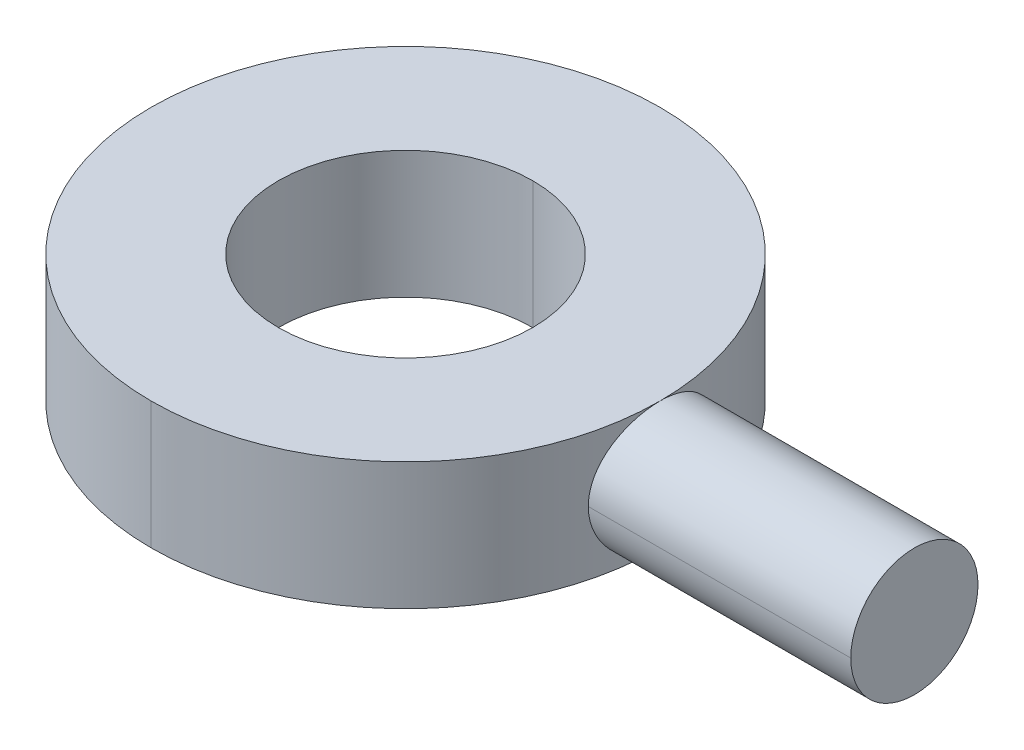
ISO-10303-21;
HEADER;
FILE_DESCRIPTION(('STEP AP214'),'2;1');
FILE_NAME('part.step','',(''),(''),'','','');
FILE_SCHEMA(('AUTOMOTIVE_DESIGN { 1 0 10303 214 1 1 1 1 }'));
ENDSEC;
DATA;
#1=APPLICATION_CONTEXT('core data for automotive mechanical design processes');
#2=APPLICATION_PROTOCOL_DEFINITION('international standard','automotive_design',2000,#1);
#3=PRODUCT_CONTEXT('',#1,'mechanical');
#4=PRODUCT('Part','Part','',(#3));
#5=PRODUCT_RELATED_PRODUCT_CATEGORY('part','',(#4));
#6=PRODUCT_DEFINITION_FORMATION('','',#4);
#7=PRODUCT_DEFINITION_CONTEXT('part definition',#1,'design');
#8=PRODUCT_DEFINITION('design','',#6,#7);
#9=PRODUCT_DEFINITION_SHAPE('','',#8);
#10=(LENGTH_UNIT() NAMED_UNIT(*) SI_UNIT(.MILLI.,.METRE.));
#11=(NAMED_UNIT(*) PLANE_ANGLE_UNIT() SI_UNIT($,.RADIAN.));
#12=(NAMED_UNIT(*) SI_UNIT($,.STERADIAN.) SOLID_ANGLE_UNIT());
#13=UNCERTAINTY_MEASURE_WITH_UNIT(LENGTH_MEASURE(1.E-05),#10,'distance_accuracy_value','');
#14=(GEOMETRIC_REPRESENTATION_CONTEXT(3) GLOBAL_UNCERTAINTY_ASSIGNED_CONTEXT((#13)) GLOBAL_UNIT_ASSIGNED_CONTEXT((#10,
#11,#12)) REPRESENTATION_CONTEXT('',''));
#15=CARTESIAN_POINT('',(0.,0.,0.));
#16=DIRECTION('',(0.,0.,1.));
#17=DIRECTION('',(1.,0.,0.));
#18=AXIS2_PLACEMENT_3D('',#15,#16,#17);
#19=CARTESIAN_POINT('',(100.,12.5,0.));
#20=DIRECTION('',(-1.,0.,0.));
#21=DIRECTION('',(0.,0.,1.));
#22=AXIS2_PLACEMENT_3D('',#19,#20,#21);
#23=CYLINDRICAL_SURFACE('',#22,12.5);
#24=CARTESIAN_POINT('',(100.,12.5,0.));
#25=DIRECTION('',(1.,0.,0.));
#26=DIRECTION('',(0.,0.,-1.));
#27=AXIS2_PLACEMENT_3D('',#24,#25,#26);
#28=CIRCLE('',#27,12.5);
#29=CARTESIAN_POINT('',(100.,12.5,-12.5));
#30=VERTEX_POINT('',#29);
#31=CARTESIAN_POINT('',(100.,12.5,12.5));
#32=VERTEX_POINT('',#31);
#33=EDGE_CURVE('E148',#30,#32,#28,.T.);
#34=ORIENTED_EDGE('',*,*,#33,.F.);
#35=DIRECTION('',(-1.,0.,0.));
#36=VECTOR('',#35,1.);
#37=CARTESIAN_POINT('',(100.,12.5,-12.5));
#38=LINE('',#37,#36);
#39=CARTESIAN_POINT('',(48.4122918275927,12.5,-12.5));
#40=VERTEX_POINT('',#39);
#41=EDGE_CURVE('E152',#30,#40,#38,.T.);
#42=ORIENTED_EDGE('',*,*,#41,.T.);
#43=CARTESIAN_POINT('',(48.4122918275927,12.5,-12.5));
#44=CARTESIAN_POINT('',(48.4122519531523,12.8456935189309,-12.5000438414443));
#45=CARTESIAN_POINT('',(48.4159931750957,13.1913731142733,-12.4856614744908));
#46=CARTESIAN_POINT('',(48.4307475860603,13.88014719941,-12.4283667765381));
#47=CARTESIAN_POINT('',(48.4417595505938,14.2232421146592,-12.3854592495393));
#48=CARTESIAN_POINT('',(48.4707358201207,14.9037129701783,-12.2715527731372));
#49=CARTESIAN_POINT('',(48.4886858982787,15.2410991482428,-12.2006113016633));
#50=CARTESIAN_POINT('',(48.5309895530518,15.9084882046774,-12.0312391309484));
#51=CARTESIAN_POINT('',(48.5553432173392,16.2384909818931,-11.9328080553419));
#52=CARTESIAN_POINT('',(48.6097365025065,16.8887912794784,-11.7092579086062));
#53=CARTESIAN_POINT('',(48.6397753687366,17.209090081408,-11.584142379273));
#54=CARTESIAN_POINT('',(48.7046751518737,17.8379018633208,-11.308169711536));
#55=CARTESIAN_POINT('',(48.7395362799559,18.1464143264041,-11.1573114457449));
#56=CARTESIAN_POINT('',(48.8131048460808,18.7497107015154,-10.8309174353739));
#57=CARTESIAN_POINT('',(48.8518132316505,19.044491205164,-10.6553756071326));
#58=CARTESIAN_POINT('',(48.931998698195,19.6183736309559,-10.2808638945076));
#59=CARTESIAN_POINT('',(48.9734758108004,19.8974753739149,-10.0818937424544));
#60=CARTESIAN_POINT('',(49.058905671041,20.4435756693406,-9.65771613587637));
#61=CARTESIAN_POINT('',(49.1028910689727,20.7102280989142,-9.43206952415031));
#62=CARTESIAN_POINT('',(49.1913473701372,21.2236819727533,-8.95930589164594));
#63=CARTESIAN_POINT('',(49.2358182788048,21.4704831945467,-8.71218863031098));
#64=CARTESIAN_POINT('',(49.3240302284843,21.9426571619296,-8.19805271085466));
#65=CARTESIAN_POINT('',(49.3677711258657,22.1680257306646,-7.93103019155515));
#66=CARTESIAN_POINT('',(49.4533151843612,22.5957567902098,-7.37886531650099));
#67=CARTESIAN_POINT('',(49.4951183643153,22.7981195047291,-7.09372313698402));
#68=CARTESIAN_POINT('',(49.5762175563378,23.1811466542233,-6.50298294406659));
#69=CARTESIAN_POINT('',(49.615469208601,23.3614597272174,-6.19715085731563));
#70=CARTESIAN_POINT('',(49.6896871340011,23.6956043616818,-5.57085338209336));
#71=CARTESIAN_POINT('',(49.7246535283887,23.8494366724711,-5.25038840800964));
#72=CARTESIAN_POINT('',(49.7892831915527,24.1293274696282,-4.59727113805758));
#73=CARTESIAN_POINT('',(49.8189496850155,24.2554028554226,-4.26462640237347));
#74=CARTESIAN_POINT('',(49.8721443661297,24.4788389293963,-3.5894023044437));
#75=CARTESIAN_POINT('',(49.8956740655167,24.5762066901745,-3.24682541203115));
#76=CARTESIAN_POINT('',(49.9295759615369,24.7153806955743,-2.66344734260586));
#77=CARTESIAN_POINT('',(49.9417578900303,24.7650269913513,-2.42458906516948));
#78=CARTESIAN_POINT('',(49.9627632828073,24.8502802538115,-1.94423792027906));
#79=CARTESIAN_POINT('',(49.9715870238673,24.8858883775073,-1.70274527163402));
#80=CARTESIAN_POINT('',(49.9857447668905,24.9428888464443,-1.21818294171803));
#81=CARTESIAN_POINT('',(49.9910815162478,24.9642923836615,-0.975114654768771));
#82=CARTESIAN_POINT('',(49.9982139141306,24.9928549009413,-0.488032450329455));
#83=CARTESIAN_POINT('',(50.0000087099502,25.0000104508834,-0.244018319296118));
#84=CARTESIAN_POINT('',(50.,25.,0.));
#85=B_SPLINE_CURVE_WITH_KNOTS('',3,(#43,#44,#45,#46,#47,#48,#49,#50,#51,#52,#53,#54,#55,#56,#57,
#58,#59,#60,#61,#62,#63,#64,#65,#66,#67,#68,#69,#70,#71,#72,#73,#74,#75,#76,#77,#78,#79,#80,#81,
#82,#83,#84),.UNSPECIFIED.,.F.,.F.,(4,2,2,2,2,2,2,2,2,2,2,2,2,2,2,2,2,2,2,2,4),(0.,
1.03674003842468,2.07330552083437,3.10775667135985,4.14222198545364,5.17655008154221,
6.21092348702068,7.24555227879674,8.28019289239135,9.33518785344895,10.39019463617,
11.4454066019952,12.5006083060576,13.5708877009475,14.6411368054543,15.7107324902355,
16.7800644417881,17.5124625500417,18.244800282127,18.9765603086904,19.7084964809608),.UNSPECIFIED.);
#86=CARTESIAN_POINT('',(50.,25.,0.));
#87=VERTEX_POINT('',#86);
#88=EDGE_CURVE('E156',#40,#87,#85,.T.);
#89=ORIENTED_EDGE('',*,*,#88,.T.);
#90=CARTESIAN_POINT('',(50.,25.,0.));
#91=CARTESIAN_POINT('',(50.0000353851579,25.0000434644936,0.345864397080895));
#92=CARTESIAN_POINT('',(49.9964125846679,24.985647266418,0.691715869367748));
#93=CARTESIAN_POINT('',(49.9821075989999,24.9282945716392,1.38084346252051));
#94=CARTESIAN_POINT('',(49.9714265125323,24.8853425200049,1.72411997580132));
#95=CARTESIAN_POINT('',(49.9432894382411,24.7713090014944,2.4049883888634));
#96=CARTESIAN_POINT('',(49.9258467914197,24.7002829211291,2.74259012522333));
#97=CARTESIAN_POINT('',(49.8846764301155,24.5307002564981,3.41041355146004));
#98=CARTESIAN_POINT('',(49.8609486493148,24.4321433817395,3.74063516342525));
#99=CARTESIAN_POINT('',(49.8078538467151,24.2082921260051,4.39138850867105));
#100=CARTESIAN_POINT('',(49.7784872288902,24.0829996603324,4.71192093419547));
#101=CARTESIAN_POINT('',(49.7149052698882,23.8066301075679,5.3411805319624));
#102=CARTESIAN_POINT('',(49.6806897229061,23.6555519259873,5.64990720242213));
#103=CARTESIAN_POINT('',(49.6083167638375,23.3286880909102,6.25358769973763));
#104=CARTESIAN_POINT('',(49.5701585196911,23.152897219256,6.5485386002301));
#105=CARTESIAN_POINT('',(49.4909175233785,22.7778645158071,7.12271639666512));
#106=CARTESIAN_POINT('',(49.4498347403539,22.57862243655,7.40194312663673));
#107=CARTESIAN_POINT('',(49.3650581243013,22.1541691968603,7.94787686221989));
#108=CARTESIAN_POINT('',(49.3213302399778,21.9285490658122,8.21426068551634));
#109=CARTESIAN_POINT('',(49.2331611896887,21.4558949277343,8.72717429054878));
#110=CARTESIAN_POINT('',(49.1887200150751,21.2088606609225,8.97370383135579));
#111=CARTESIAN_POINT('',(49.1003361335477,20.6949424195365,9.44534721429645));
#112=CARTESIAN_POINT('',(49.0563935402802,20.4280540201688,9.67045625691743));
#113=CARTESIAN_POINT('',(48.9702382961189,19.8762116985148,10.0976860637948));
#114=CARTESIAN_POINT('',(48.9280256304544,19.5912579305275,10.2998070243547));
#115=CARTESIAN_POINT('',(48.8459005479228,19.0006756753362,10.6825514917154));
#116=CARTESIAN_POINT('',(48.8060328421376,18.6947987866027,10.8628015817255));
#117=CARTESIAN_POINT('',(48.7304900022203,18.068418823622,11.19681562835));
#118=CARTESIAN_POINT('',(48.6948147478651,17.7479161691503,11.3505803445199));
#119=CARTESIAN_POINT('',(48.6287574014613,17.0947306268087,11.630331388659));
#120=CARTESIAN_POINT('',(48.5983719191793,16.7620557068919,11.7563355223369));
#121=CARTESIAN_POINT('',(48.5438120978055,16.0867604855525,11.9796305293237));
#122=CARTESIAN_POINT('',(48.5196362151463,15.744142679323,12.076928539228));
#123=CARTESIAN_POINT('',(48.4847879268861,15.160952352703,12.2159193460693));
#124=CARTESIAN_POINT('',(48.4722622855959,14.9223302183091,12.2654684084595));
#125=CARTESIAN_POINT('',(48.4506520039379,14.4424509190243,12.3505565676766));
#126=CARTESIAN_POINT('',(48.4415670770253,14.2011939752844,12.3860968311755));
#127=CARTESIAN_POINT('',(48.4269849261362,13.7170875925611,12.4429916084321));
#128=CARTESIAN_POINT('',(48.4214850830883,13.4742394473259,12.4643564781824));
#129=CARTESIAN_POINT('',(48.4141331685501,12.987595800071,12.492867681304));
#130=CARTESIAN_POINT('',(48.4122819878133,12.7438000812706,12.5000105426389));
#131=CARTESIAN_POINT('',(48.4122918275927,12.5,12.5));
#132=B_SPLINE_CURVE_WITH_KNOTS('',3,(#90,#91,#92,#93,#94,#95,#96,#97,#98,#99,#100,#101,#102,
#103,#104,#105,#106,#107,#108,#109,#110,#111,#112,#113,#114,#115,#116,#117,#118,#119,#120,#121,
#122,#123,#124,#125,#126,#127,#128,#129,#130,#131),.UNSPECIFIED.,.F.,.F.,(4,2,2,2,2,2,2,2,2,2,2,
2,2,2,2,2,2,2,2,2,4),(0.,1.03725511374434,2.0743488037948,3.10940657049817,4.14447525909134,
5.17946982158484,6.21450832590989,7.24976571086483,8.28503402106688,9.33927327996868,
10.393525329992,11.4480130440059,12.5024917526973,13.5729969152005,14.6434713723183,
15.7132572124358,16.7827768698235,17.5144754824531,18.246113145332,18.9772157118582,
19.7084967414768),.UNSPECIFIED.);
#133=CARTESIAN_POINT('',(48.4122918275927,12.5,12.5));
#134=VERTEX_POINT('',#133);
#135=EDGE_CURVE('E10',#87,#134,#132,.T.);
#136=ORIENTED_EDGE('',*,*,#135,.T.);
#137=DIRECTION('',(-1.,0.,0.));
#138=VECTOR('',#137,1.);
#139=CARTESIAN_POINT('',(100.,12.5,12.5));
#140=LINE('',#139,#138);
#141=EDGE_CURVE('E175',#32,#134,#140,.T.);
#142=ORIENTED_EDGE('',*,*,#141,.F.);
#143=EDGE_LOOP('',(#34,#42,#89,#136,#142));
#144=FACE_BOUND('',#143,.T.);
#145=ADVANCED_FACE('F16',(#144),#23,.T.);
#146=CARTESIAN_POINT('',(0.,25.,0.));
#147=DIRECTION('',(0.,-1.,0.));
#148=DIRECTION('',(0.,0.,-1.));
#149=AXIS2_PLACEMENT_3D('',#146,#147,#148);
#150=CYLINDRICAL_SURFACE('',#149,25.);
#151=CARTESIAN_POINT('',(0.,25.,0.));
#152=DIRECTION('',(0.,1.,0.));
#153=DIRECTION('',(0.,0.,1.));
#154=AXIS2_PLACEMENT_3D('',#151,#152,#153);
#155=CIRCLE('',#154,25.);
#156=CARTESIAN_POINT('',(0.,25.,-25.));
#157=VERTEX_POINT('',#156);
#158=CARTESIAN_POINT('',(0.,25.,25.));
#159=VERTEX_POINT('',#158);
#160=EDGE_CURVE('E108',#157,#159,#155,.T.);
#161=ORIENTED_EDGE('',*,*,#160,.T.);
#162=DIRECTION('',(0.,-1.,0.));
#163=VECTOR('',#162,1.);
#164=CARTESIAN_POINT('',(0.,25.,25.));
#165=LINE('',#164,#163);
#166=CARTESIAN_POINT('',(0.,0.,25.));
#167=VERTEX_POINT('',#166);
#168=EDGE_CURVE('E137',#159,#167,#165,.T.);
#169=ORIENTED_EDGE('',*,*,#168,.T.);
#170=CARTESIAN_POINT('',(0.,0.,0.));
#171=DIRECTION('',(0.,1.,0.));
#172=DIRECTION('',(0.,0.,1.));
#173=AXIS2_PLACEMENT_3D('',#170,#171,#172);
#174=CIRCLE('',#173,25.);
#175=CARTESIAN_POINT('',(0.,0.,-25.));
#176=VERTEX_POINT('',#175);
#177=EDGE_CURVE('E115',#176,#167,#174,.T.);
#178=ORIENTED_EDGE('',*,*,#177,.F.);
#179=DIRECTION('',(0.,-1.,0.));
#180=VECTOR('',#179,1.);
#181=CARTESIAN_POINT('',(0.,25.,-25.));
#182=LINE('',#181,#180);
#183=EDGE_CURVE('E131',#157,#176,#182,.T.);
#184=ORIENTED_EDGE('',*,*,#183,.F.);
#185=EDGE_LOOP('',(#161,#169,#178,#184));
#186=FACE_BOUND('',#185,.T.);
#187=ADVANCED_FACE('F132',(#186),#150,.F.);
#188=CARTESIAN_POINT('',(0.,25.,0.));
#189=DIRECTION('',(0.,-1.,0.));
#190=DIRECTION('',(0.,0.,-1.));
#191=AXIS2_PLACEMENT_3D('',#188,#189,#190);
#192=CYLINDRICAL_SURFACE('',#191,50.);
#193=CARTESIAN_POINT('',(0.,25.,0.));
#194=DIRECTION('',(0.,1.,0.));
#195=DIRECTION('',(1.,0.,0.));
#196=AXIS2_PLACEMENT_3D('',#193,#194,#195);
#197=CIRCLE('',#196,50.);
#198=CARTESIAN_POINT('',(0.,25.,50.));
#199=VERTEX_POINT('',#198);
#200=EDGE_CURVE('E128',#199,#87,#197,.T.);
#201=ORIENTED_EDGE('',*,*,#200,.F.);
#202=DIRECTION('',(0.,-1.,0.));
#203=VECTOR('',#202,1.);
#204=CARTESIAN_POINT('',(0.,25.,50.));
#205=LINE('',#204,#203);
#206=CARTESIAN_POINT('',(0.,0.,50.));
#207=VERTEX_POINT('',#206);
#208=EDGE_CURVE('E33',#199,#207,#205,.T.);
#209=ORIENTED_EDGE('',*,*,#208,.T.);
#210=CARTESIAN_POINT('',(0.,0.,0.));
#211=DIRECTION('',(0.,1.,0.));
#212=DIRECTION('',(1.,0.,0.));
#213=AXIS2_PLACEMENT_3D('',#210,#211,#212);
#214=CIRCLE('',#213,50.);
#215=CARTESIAN_POINT('',(50.,0.,0.));
#216=VERTEX_POINT('',#215);
#217=EDGE_CURVE('E98',#207,#216,#214,.T.);
#218=ORIENTED_EDGE('',*,*,#217,.T.);
#219=CARTESIAN_POINT('',(48.4122918275927,12.5,12.5));
#220=CARTESIAN_POINT('',(48.4122519531523,12.1543064810691,12.5000438414443));
#221=CARTESIAN_POINT('',(48.4159931750957,11.8086268857267,12.4856614744908));
#222=CARTESIAN_POINT('',(48.4307475860603,11.11985280059,12.4283667765381));
#223=CARTESIAN_POINT('',(48.4417595505938,10.7767578853408,12.3854592495393));
#224=CARTESIAN_POINT('',(48.4707358201207,10.0962870298217,12.2715527731372));
#225=CARTESIAN_POINT('',(48.4886858982787,9.7589008517572,12.2006113016633));
#226=CARTESIAN_POINT('',(48.5309895530518,9.09151179532258,12.0312391309484));
#227=CARTESIAN_POINT('',(48.5553432173392,8.76150901810687,11.9328080553419));
#228=CARTESIAN_POINT('',(48.6097365025065,8.11120872052162,11.7092579086062));
#229=CARTESIAN_POINT('',(48.6397753687366,7.79090991859201,11.584142379273));
#230=CARTESIAN_POINT('',(48.7046751518737,7.16209813667915,11.308169711536));
#231=CARTESIAN_POINT('',(48.7395362799559,6.85358567359586,11.1573114457449));
#232=CARTESIAN_POINT('',(48.8131048460808,6.25028929848459,10.8309174353739));
#233=CARTESIAN_POINT('',(48.8518132316505,5.95550879483602,10.6553756071326));
#234=CARTESIAN_POINT('',(48.931998698195,5.38162636904414,10.2808638945076));
#235=CARTESIAN_POINT('',(48.9734758108004,5.10252462608506,10.0818937424544));
#236=CARTESIAN_POINT('',(49.058905671041,4.55642433065941,9.65771613587636));
#237=CARTESIAN_POINT('',(49.1028910689727,4.2897719010858,9.4320695241503));
#238=CARTESIAN_POINT('',(49.1913473701372,3.77631802724667,8.95930589164594));
#239=CARTESIAN_POINT('',(49.2358182788048,3.52951680545328,8.71218863031098));
#240=CARTESIAN_POINT('',(49.3240302284843,3.05734283807036,8.19805271085466));
#241=CARTESIAN_POINT('',(49.3677711258657,2.83197426933538,7.93103019155515));
#242=CARTESIAN_POINT('',(49.4533151843612,2.40424320979017,7.37886531650098));
#243=CARTESIAN_POINT('',(49.4951183643153,2.20188049527094,7.09372313698401));
#244=CARTESIAN_POINT('',(49.5762175563378,1.81885334577669,6.50298294406659));
#245=CARTESIAN_POINT('',(49.615469208601,1.6385402727826,6.19715085731562));
#246=CARTESIAN_POINT('',(49.6896871340011,1.30439563831816,5.57085338209335));
#247=CARTESIAN_POINT('',(49.7246535283887,1.15056332752893,5.25038840800963));
#248=CARTESIAN_POINT('',(49.7892831915527,0.870672530371757,4.59727113805757));
#249=CARTESIAN_POINT('',(49.8189496850155,0.744597144577391,4.26462640237347));
#250=CARTESIAN_POINT('',(49.8721443661296,0.521161070603744,3.58940230444369));
#251=CARTESIAN_POINT('',(49.8956740655167,0.42379330982553,3.24682541203114));
#252=CARTESIAN_POINT('',(49.9295759615369,0.284619304425699,2.66344734260586));
#253=CARTESIAN_POINT('',(49.9417578900303,0.234973008648707,2.42458906516947));
#254=CARTESIAN_POINT('',(49.9627632828073,0.149719746188495,1.94423792027905));
#255=CARTESIAN_POINT('',(49.9715870238673,0.114111622492734,1.70274527163401));
#256=CARTESIAN_POINT('',(49.9857447668905,0.0571111535556771,1.21818294171803));
#257=CARTESIAN_POINT('',(49.9910815162478,0.0357076163384857,0.97511465476877));
#258=CARTESIAN_POINT('',(49.9982139141306,0.00714509905867147,0.488032450329455));
#259=CARTESIAN_POINT('',(50.0000087099502,-1.04508833795667E-05,0.244018319296117));
#260=CARTESIAN_POINT('',(50.,0.,0.));
#261=B_SPLINE_CURVE_WITH_KNOTS('',3,(#219,#220,#221,#222,#223,#224,#225,#226,#227,#228,#229,
#230,#231,#232,#233,#234,#235,#236,#237,#238,#239,#240,#241,#242,#243,#244,#245,#246,#247,#248,
#249,#250,#251,#252,#253,#254,#255,#256,#257,#258,#259,#260),.UNSPECIFIED.,.F.,.F.,(4,2,2,2,2,2,
2,2,2,2,2,2,2,2,2,2,2,2,2,2,4),(0.,1.03674003842468,2.07330552083437,3.10775667135985,
4.14222198545364,5.17655008154221,6.21092348702069,7.24555227879674,8.28019289239136,
9.33518785344895,10.39019463617,11.4454066019952,12.5006083060576,13.5708877009475,
14.6411368054543,15.7107324902355,16.7800644417881,17.5124625500417,18.244800282127,
18.9765603086904,19.7084964809607),.UNSPECIFIED.);
#262=EDGE_CURVE('E20',#134,#216,#261,.T.);
#263=ORIENTED_EDGE('',*,*,#262,.F.);
#264=ORIENTED_EDGE('',*,*,#135,.F.);
#265=EDGE_LOOP('',(#201,#209,#218,#263,#264));
#266=FACE_BOUND('',#265,.T.);
#267=ADVANCED_FACE('F196',(#266),#192,.T.);
#268=CARTESIAN_POINT('',(0.,25.,0.));
#269=DIRECTION('',(0.,-1.,0.));
#270=DIRECTION('',(0.,0.,-1.));
#271=AXIS2_PLACEMENT_3D('',#268,#269,#270);
#272=CYLINDRICAL_SURFACE('',#271,50.);
#273=ORIENTED_EDGE('',*,*,#208,.F.);
#274=CARTESIAN_POINT('',(0.,25.,0.));
#275=DIRECTION('',(0.,1.,0.));
#276=DIRECTION('',(1.,0.,0.));
#277=AXIS2_PLACEMENT_3D('',#274,#275,#276);
#278=CIRCLE('',#277,50.);
#279=CARTESIAN_POINT('',(0.,25.,-50.));
#280=VERTEX_POINT('',#279);
#281=EDGE_CURVE('E171',#280,#199,#278,.T.);
#282=ORIENTED_EDGE('',*,*,#281,.F.);
#283=DIRECTION('',(0.,-1.,0.));
#284=VECTOR('',#283,1.);
#285=CARTESIAN_POINT('',(0.,25.,-50.));
#286=LINE('',#285,#284);
#287=CARTESIAN_POINT('',(0.,0.,-50.));
#288=VERTEX_POINT('',#287);
#289=EDGE_CURVE('E127',#280,#288,#286,.T.);
#290=ORIENTED_EDGE('',*,*,#289,.T.);
#291=CARTESIAN_POINT('',(0.,0.,0.));
#292=DIRECTION('',(0.,1.,0.));
#293=DIRECTION('',(1.,0.,0.));
#294=AXIS2_PLACEMENT_3D('',#291,#292,#293);
#295=CIRCLE('',#294,50.);
#296=EDGE_CURVE('E157',#288,#207,#295,.T.);
#297=ORIENTED_EDGE('',*,*,#296,.T.);
#298=EDGE_LOOP('',(#273,#282,#290,#297));
#299=FACE_BOUND('',#298,.T.);
#300=ADVANCED_FACE('F223',(#299),#272,.T.);
#301=CARTESIAN_POINT('',(0.,25.,0.));
#302=DIRECTION('',(0.,-1.,0.));
#303=DIRECTION('',(0.,0.,-1.));
#304=AXIS2_PLACEMENT_3D('',#301,#302,#303);
#305=CYLINDRICAL_SURFACE('',#304,50.);
#306=ORIENTED_EDGE('',*,*,#289,.F.);
#307=CARTESIAN_POINT('',(0.,25.,0.));
#308=DIRECTION('',(0.,1.,0.));
#309=DIRECTION('',(1.,0.,0.));
#310=AXIS2_PLACEMENT_3D('',#307,#308,#309);
#311=CIRCLE('',#310,50.);
#312=EDGE_CURVE('E167',#87,#280,#311,.T.);
#313=ORIENTED_EDGE('',*,*,#312,.F.);
#314=ORIENTED_EDGE('',*,*,#88,.F.);
#315=CARTESIAN_POINT('',(50.,0.,0.));
#316=CARTESIAN_POINT('',(50.0000353851579,-4.34644935593339E-05,-0.345864397080895));
#317=CARTESIAN_POINT('',(49.9964125846679,0.0143527335819862,-0.691715869367748));
#318=CARTESIAN_POINT('',(49.9821075989999,0.0717054283608394,-1.38084346252051));
#319=CARTESIAN_POINT('',(49.9714265125323,0.114657479995139,-1.72411997580132));
#320=CARTESIAN_POINT('',(49.9432894382411,0.228690998505611,-2.4049883888634));
#321=CARTESIAN_POINT('',(49.9258467914197,0.299717078870852,-2.74259012522333));
#322=CARTESIAN_POINT('',(49.8846764301155,0.469299743501866,-3.41041355146003));
#323=CARTESIAN_POINT('',(49.8609486493148,0.567856618260552,-3.74063516342525));
#324=CARTESIAN_POINT('',(49.8078538467151,0.791707873994942,-4.39138850867104));
#325=CARTESIAN_POINT('',(49.7784872288902,0.917000339667571,-4.71192093419547));
#326=CARTESIAN_POINT('',(49.7149052698882,1.19336989243213,-5.34118053196239));
#327=CARTESIAN_POINT('',(49.6806897229061,1.34444807401266,-5.64990720242212));
#328=CARTESIAN_POINT('',(49.6083167638375,1.67131190908979,-6.25358769973762));
#329=CARTESIAN_POINT('',(49.5701585196911,1.84710278074402,-6.54853860023009));
#330=CARTESIAN_POINT('',(49.4909175233785,2.22213548419291,-7.12271639666512));
#331=CARTESIAN_POINT('',(49.4498347403539,2.42137756344996,-7.40194312663673));
#332=CARTESIAN_POINT('',(49.3650581243013,2.84583080313967,-7.94787686221989));
#333=CARTESIAN_POINT('',(49.3213302399778,3.07145093418777,-8.21426068551634));
#334=CARTESIAN_POINT('',(49.2331611896887,3.54410507226565,-8.72717429054878));
#335=CARTESIAN_POINT('',(49.1887200150752,3.79113933907753,-8.97370383135579));
#336=CARTESIAN_POINT('',(49.1003361335477,4.30505758046353,-9.44534721429645));
#337=CARTESIAN_POINT('',(49.0563935402802,4.57194597983122,-9.67045625691743));
#338=CARTESIAN_POINT('',(48.9702382961189,5.1237883014852,-10.0976860637948));
#339=CARTESIAN_POINT('',(48.9280256304544,5.4087420694725,-10.2998070243547));
#340=CARTESIAN_POINT('',(48.8459005479228,5.99932432466381,-10.6825514917154));
#341=CARTESIAN_POINT('',(48.8060328421376,6.30520121339725,-10.8628015817255));
#342=CARTESIAN_POINT('',(48.7304900022203,6.93158117637802,-11.19681562835));
#343=CARTESIAN_POINT('',(48.6948147478651,7.25208383084966,-11.3505803445199));
#344=CARTESIAN_POINT('',(48.6287574014613,7.90526937319135,-11.630331388659));
#345=CARTESIAN_POINT('',(48.5983719191793,8.23794429310814,-11.7563355223369));
#346=CARTESIAN_POINT('',(48.5438120978055,8.91323951444753,-11.9796305293237));
#347=CARTESIAN_POINT('',(48.5196362151463,9.25585732067701,-12.076928539228));
#348=CARTESIAN_POINT('',(48.4847879268861,9.83904764729703,-12.2159193460693));
#349=CARTESIAN_POINT('',(48.4722622855959,10.0776697816909,-12.2654684084595));
#350=CARTESIAN_POINT('',(48.4506520039379,10.5575490809757,-12.3505565676766));
#351=CARTESIAN_POINT('',(48.4415670770253,10.7988060247156,-12.3860968311755));
#352=CARTESIAN_POINT('',(48.4269849261362,11.2829124074389,-12.4429916084321));
#353=CARTESIAN_POINT('',(48.4214850830883,11.5257605526741,-12.4643564781824));
#354=CARTESIAN_POINT('',(48.4141331685501,12.012404199929,-12.492867681304));
#355=CARTESIAN_POINT('',(48.4122819878133,12.2561999187294,-12.5000105426389));
#356=CARTESIAN_POINT('',(48.4122918275927,12.5,-12.5));
#357=B_SPLINE_CURVE_WITH_KNOTS('',3,(#315,#316,#317,#318,#319,#320,#321,#322,#323,#324,#325,
#326,#327,#328,#329,#330,#331,#332,#333,#334,#335,#336,#337,#338,#339,#340,#341,#342,#343,#344,
#345,#346,#347,#348,#349,#350,#351,#352,#353,#354,#355,#356),.UNSPECIFIED.,.F.,.F.,(4,2,2,2,2,2,
2,2,2,2,2,2,2,2,2,2,2,2,2,2,4),(0.,1.03725511374434,2.0743488037948,3.10940657049816,
4.14447525909133,5.17946982158483,6.21450832590988,7.24976571086483,8.28503402106687,
9.33927327996868,10.393525329992,11.4480130440059,12.5024917526972,13.5729969152005,
14.6434713723183,15.7132572124357,16.7827768698235,17.5144754824531,18.246113145332,
18.9772157118582,19.7084967414768),.UNSPECIFIED.);
#358=EDGE_CURVE('E144',#216,#40,#357,.T.);
#359=ORIENTED_EDGE('',*,*,#358,.F.);
#360=CARTESIAN_POINT('',(0.,0.,0.));
#361=DIRECTION('',(0.,1.,0.));
#362=DIRECTION('',(1.,0.,0.));
#363=AXIS2_PLACEMENT_3D('',#360,#361,#362);
#364=CIRCLE('',#363,50.);
#365=EDGE_CURVE('E164',#216,#288,#364,.T.);
#366=ORIENTED_EDGE('',*,*,#365,.T.);
#367=EDGE_LOOP('',(#306,#313,#314,#359,#366));
#368=FACE_BOUND('',#367,.T.);
#369=ADVANCED_FACE('F229',(#368),#305,.T.);
#370=CARTESIAN_POINT('',(0.,25.,0.));
#371=DIRECTION('',(0.,1.,0.));
#372=DIRECTION('',(1.,0.,0.));
#373=AXIS2_PLACEMENT_3D('',#370,#371,#372);
#374=PLANE('',#373);
#375=ORIENTED_EDGE('',*,*,#160,.F.);
#376=CARTESIAN_POINT('',(0.,25.,0.));
#377=DIRECTION('',(0.,1.,0.));
#378=DIRECTION('',(0.,0.,1.));
#379=AXIS2_PLACEMENT_3D('',#376,#377,#378);
#380=CIRCLE('',#379,25.);
#381=EDGE_CURVE('E124',#159,#157,#380,.T.);
#382=ORIENTED_EDGE('',*,*,#381,.F.);
#383=EDGE_LOOP('',(#375,#382));
#384=FACE_BOUND('',#383,.T.);
#385=ORIENTED_EDGE('',*,*,#312,.T.);
#386=ORIENTED_EDGE('',*,*,#281,.T.);
#387=ORIENTED_EDGE('',*,*,#200,.T.);
#388=EDGE_LOOP('',(#385,#386,#387));
#389=FACE_BOUND('',#388,.T.);
#390=ADVANCED_FACE('F121',(#384,#389),#374,.T.);
#391=CARTESIAN_POINT('',(0.,0.,0.));
#392=DIRECTION('',(0.,1.,0.));
#393=DIRECTION('',(1.,0.,0.));
#394=AXIS2_PLACEMENT_3D('',#391,#392,#393);
#395=PLANE('',#394);
#396=ORIENTED_EDGE('',*,*,#177,.T.);
#397=CARTESIAN_POINT('',(0.,0.,0.));
#398=DIRECTION('',(0.,1.,0.));
#399=DIRECTION('',(0.,0.,1.));
#400=AXIS2_PLACEMENT_3D('',#397,#398,#399);
#401=CIRCLE('',#400,25.);
#402=EDGE_CURVE('E135',#167,#176,#401,.T.);
#403=ORIENTED_EDGE('',*,*,#402,.T.);
#404=EDGE_LOOP('',(#396,#403));
#405=FACE_BOUND('',#404,.T.);
#406=ORIENTED_EDGE('',*,*,#365,.F.);
#407=ORIENTED_EDGE('',*,*,#217,.F.);
#408=ORIENTED_EDGE('',*,*,#296,.F.);
#409=EDGE_LOOP('',(#406,#407,#408));
#410=FACE_BOUND('',#409,.T.);
#411=ADVANCED_FACE('F227',(#405,#410),#395,.F.);
#412=CARTESIAN_POINT('',(0.,25.,0.));
#413=DIRECTION('',(0.,-1.,0.));
#414=DIRECTION('',(0.,0.,-1.));
#415=AXIS2_PLACEMENT_3D('',#412,#413,#414);
#416=CYLINDRICAL_SURFACE('',#415,25.);
#417=ORIENTED_EDGE('',*,*,#168,.F.);
#418=ORIENTED_EDGE('',*,*,#381,.T.);
#419=ORIENTED_EDGE('',*,*,#183,.T.);
#420=ORIENTED_EDGE('',*,*,#402,.F.);
#421=EDGE_LOOP('',(#417,#418,#419,#420));
#422=FACE_BOUND('',#421,.T.);
#423=ADVANCED_FACE('F18',(#422),#416,.F.);
#424=CARTESIAN_POINT('',(100.,12.5,0.));
#425=DIRECTION('',(-1.,0.,0.));
#426=DIRECTION('',(0.,0.,1.));
#427=AXIS2_PLACEMENT_3D('',#424,#425,#426);
#428=CYLINDRICAL_SURFACE('',#427,12.5);
#429=ORIENTED_EDGE('',*,*,#41,.F.);
#430=CARTESIAN_POINT('',(100.,12.5,0.));
#431=DIRECTION('',(1.,0.,0.));
#432=DIRECTION('',(0.,0.,-1.));
#433=AXIS2_PLACEMENT_3D('',#430,#431,#432);
#434=CIRCLE('',#433,12.5);
#435=EDGE_CURVE('E153',#32,#30,#434,.T.);
#436=ORIENTED_EDGE('',*,*,#435,.F.);
#437=ORIENTED_EDGE('',*,*,#141,.T.);
#438=ORIENTED_EDGE('',*,*,#262,.T.);
#439=ORIENTED_EDGE('',*,*,#358,.T.);
#440=EDGE_LOOP('',(#429,#436,#437,#438,#439));
#441=FACE_BOUND('',#440,.T.);
#442=ADVANCED_FACE('F232',(#441),#428,.T.);
#443=CARTESIAN_POINT('',(100.,12.5,0.));
#444=DIRECTION('',(1.,0.,0.));
#445=DIRECTION('',(0.,1.,0.));
#446=AXIS2_PLACEMENT_3D('',#443,#444,#445);
#447=PLANE('',#446);
#448=ORIENTED_EDGE('',*,*,#435,.T.);
#449=ORIENTED_EDGE('',*,*,#33,.T.);
#450=EDGE_LOOP('',(#448,#449));
#451=FACE_BOUND('',#450,.T.);
#452=ADVANCED_FACE('F211',(#451),#447,.T.);
#453=CLOSED_SHELL('',(#145,#187,#267,#300,#369,#390,#411,#423,#442,#452));
#454=MANIFOLD_SOLID_BREP('B1',#453);
#455=ADVANCED_BREP_SHAPE_REPRESENTATION('',(#18,#454),#14);
#456=SHAPE_DEFINITION_REPRESENTATION(#9,#455);
ENDSEC;
END-ISO-10303-21;
